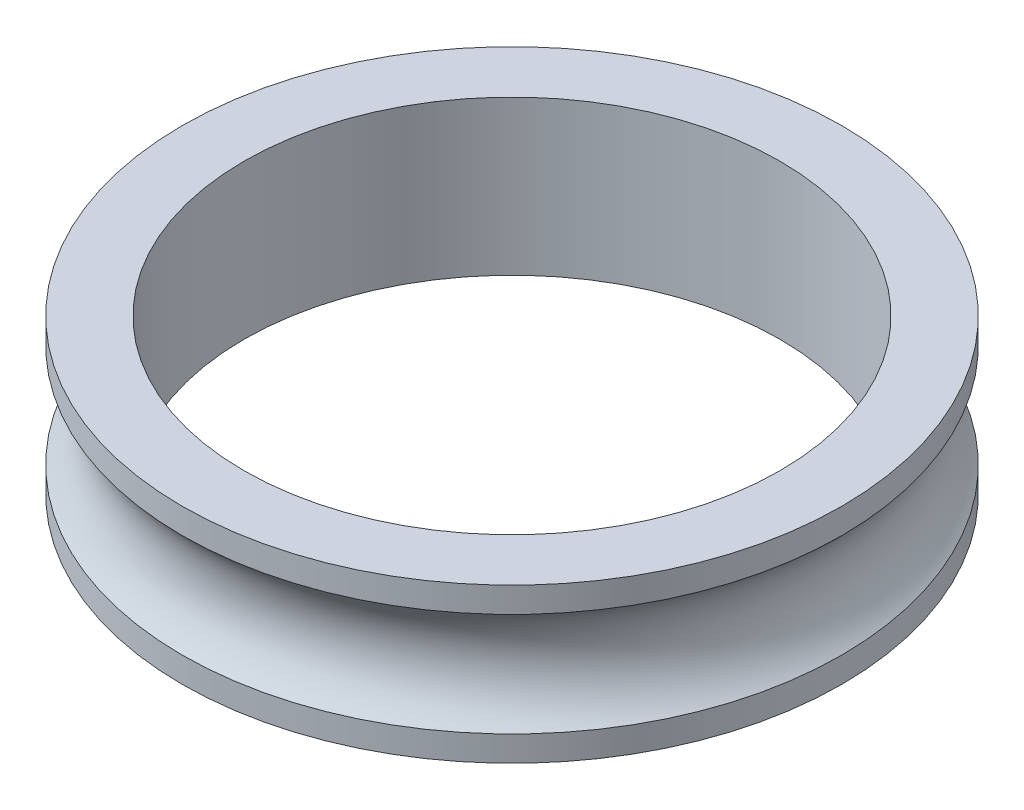
ISO-10303-21;
HEADER;
FILE_DESCRIPTION(('STEP AP214'),'2;1');
FILE_NAME('part.step','',(''),(''),'','','');
FILE_SCHEMA(('AUTOMOTIVE_DESIGN { 1 0 10303 214 1 1 1 1 }'));
ENDSEC;
DATA;
#1=APPLICATION_CONTEXT('core data for automotive mechanical design processes');
#2=APPLICATION_PROTOCOL_DEFINITION('international standard','automotive_design',2000,#1);
#3=PRODUCT_CONTEXT('',#1,'mechanical');
#4=PRODUCT('Part','Part','',(#3));
#5=PRODUCT_RELATED_PRODUCT_CATEGORY('part','',(#4));
#6=PRODUCT_DEFINITION_FORMATION('','',#4);
#7=PRODUCT_DEFINITION_CONTEXT('part definition',#1,'design');
#8=PRODUCT_DEFINITION('design','',#6,#7);
#9=PRODUCT_DEFINITION_SHAPE('','',#8);
#10=(LENGTH_UNIT() NAMED_UNIT(*) SI_UNIT(.MILLI.,.METRE.));
#11=(NAMED_UNIT(*) PLANE_ANGLE_UNIT() SI_UNIT($,.RADIAN.));
#12=(NAMED_UNIT(*) SI_UNIT($,.STERADIAN.) SOLID_ANGLE_UNIT());
#13=UNCERTAINTY_MEASURE_WITH_UNIT(LENGTH_MEASURE(1.E-05),#10,'distance_accuracy_value','');
#14=(GEOMETRIC_REPRESENTATION_CONTEXT(3) GLOBAL_UNCERTAINTY_ASSIGNED_CONTEXT((#13)) GLOBAL_UNIT_ASSIGNED_CONTEXT((#10,
#11,#12)) REPRESENTATION_CONTEXT('',''));
#15=CARTESIAN_POINT('',(0.,0.,0.));
#16=DIRECTION('',(0.,0.,1.));
#17=DIRECTION('',(1.,0.,0.));
#18=AXIS2_PLACEMENT_3D('',#15,#16,#17);
#19=CARTESIAN_POINT('',(34.75,10.,0.));
#20=DIRECTION('',(0.,-1.,0.));
#21=DIRECTION('',(0.,0.,-1.));
#22=AXIS2_PLACEMENT_3D('',#19,#20,#21);
#23=PLANE('',#22);
#24=CARTESIAN_POINT('',(0.,10.,0.));
#25=DIRECTION('',(0.,1.,0.));
#26=DIRECTION('',(0.,0.,1.));
#27=AXIS2_PLACEMENT_3D('',#24,#25,#26);
#28=CIRCLE('',#27,34.75);
#29=CARTESIAN_POINT('',(0.,10.,34.75));
#30=VERTEX_POINT('',#29);
#31=EDGE_CURVE('E10',#30,#30,#28,.T.);
#32=ORIENTED_EDGE('',*,*,#31,.F.);
#33=EDGE_LOOP('',(#32));
#34=FACE_BOUND('',#33,.T.);
#35=CARTESIAN_POINT('',(0.,10.,0.));
#36=DIRECTION('',(0.,1.,0.));
#37=DIRECTION('',(0.,0.,1.));
#38=AXIS2_PLACEMENT_3D('',#35,#36,#37);
#39=CIRCLE('',#38,42.75);
#40=CARTESIAN_POINT('',(0.,10.,42.75));
#41=VERTEX_POINT('',#40);
#42=EDGE_CURVE('E55',#41,#41,#39,.T.);
#43=ORIENTED_EDGE('',*,*,#42,.T.);
#44=EDGE_LOOP('',(#43));
#45=FACE_BOUND('',#44,.T.);
#46=ADVANCED_FACE('F33',(#34,#45),#23,.F.);
#47=CARTESIAN_POINT('',(0.,53.3742130251369,0.));
#48=DIRECTION('',(0.,1.,0.));
#49=DIRECTION('',(0.,0.,1.));
#50=AXIS2_PLACEMENT_3D('',#47,#48,#49);
#51=CYLINDRICAL_SURFACE('',#50,34.75);
#52=CARTESIAN_POINT('',(0.,-9.99999999999999,0.));
#53=DIRECTION('',(0.,1.,0.));
#54=DIRECTION('',(0.,0.,1.));
#55=AXIS2_PLACEMENT_3D('',#52,#53,#54);
#56=CIRCLE('',#55,34.75);
#57=CARTESIAN_POINT('',(0.,-9.99999999999999,34.75));
#58=VERTEX_POINT('',#57);
#59=EDGE_CURVE('E39',#58,#58,#56,.T.);
#60=ORIENTED_EDGE('',*,*,#59,.F.);
#61=EDGE_LOOP('',(#60));
#62=FACE_BOUND('',#61,.T.);
#63=ORIENTED_EDGE('',*,*,#31,.T.);
#64=EDGE_LOOP('',(#63));
#65=FACE_BOUND('',#64,.T.);
#66=ADVANCED_FACE('F80',(#62,#65),#51,.F.);
#67=CARTESIAN_POINT('',(34.75,-10.,0.));
#68=DIRECTION('',(0.,1.,0.));
#69=DIRECTION('',(0.,0.,1.));
#70=AXIS2_PLACEMENT_3D('',#67,#68,#69);
#71=PLANE('',#70);
#72=CARTESIAN_POINT('',(0.,-9.99999999999999,0.));
#73=DIRECTION('',(0.,1.,0.));
#74=DIRECTION('',(0.,0.,1.));
#75=AXIS2_PLACEMENT_3D('',#72,#73,#74);
#76=CIRCLE('',#75,42.75);
#77=CARTESIAN_POINT('',(0.,-9.99999999999999,42.75));
#78=VERTEX_POINT('',#77);
#79=EDGE_CURVE('E43',#78,#78,#76,.T.);
#80=ORIENTED_EDGE('',*,*,#79,.F.);
#81=EDGE_LOOP('',(#80));
#82=FACE_BOUND('',#81,.T.);
#83=ORIENTED_EDGE('',*,*,#59,.T.);
#84=EDGE_LOOP('',(#83));
#85=FACE_BOUND('',#84,.T.);
#86=ADVANCED_FACE('F75',(#82,#85),#71,.F.);
#87=CARTESIAN_POINT('',(0.,53.3742130251369,0.));
#88=DIRECTION('',(0.,1.,0.));
#89=DIRECTION('',(0.,0.,1.));
#90=AXIS2_PLACEMENT_3D('',#87,#88,#89);
#91=CYLINDRICAL_SURFACE('',#90,42.75);
#92=CARTESIAN_POINT('',(0.,-6.70820393249936,0.));
#93=DIRECTION('',(0.,1.,0.));
#94=DIRECTION('',(0.,0.,1.));
#95=AXIS2_PLACEMENT_3D('',#92,#93,#94);
#96=CIRCLE('',#95,42.75);
#97=CARTESIAN_POINT('',(0.,-6.70820393249936,42.75));
#98=VERTEX_POINT('',#97);
#99=EDGE_CURVE('E47',#98,#98,#96,.T.);
#100=ORIENTED_EDGE('',*,*,#99,.F.);
#101=EDGE_LOOP('',(#100));
#102=FACE_BOUND('',#101,.T.);
#103=ORIENTED_EDGE('',*,*,#79,.T.);
#104=EDGE_LOOP('',(#103));
#105=FACE_BOUND('',#104,.T.);
#106=ADVANCED_FACE('F69',(#102,#105),#91,.T.);
#107=CARTESIAN_POINT('',(0.,0.,0.));
#108=DIRECTION('',(0.,1.,0.));
#109=DIRECTION('',(0.,0.,1.));
#110=AXIS2_PLACEMENT_3D('',#107,#108,#109);
#111=TOROIDAL_SURFACE('',#110,48.75,9.);
#112=CARTESIAN_POINT('',(0.,6.70820393249936,0.));
#113=DIRECTION('',(0.,1.,0.));
#114=DIRECTION('',(0.,0.,1.));
#115=AXIS2_PLACEMENT_3D('',#112,#113,#114);
#116=CIRCLE('',#115,42.75);
#117=CARTESIAN_POINT('',(0.,6.70820393249936,42.75));
#118=VERTEX_POINT('',#117);
#119=EDGE_CURVE('E52',#118,#118,#116,.T.);
#120=ORIENTED_EDGE('',*,*,#119,.F.);
#121=EDGE_LOOP('',(#120));
#122=FACE_BOUND('',#121,.T.);
#123=ORIENTED_EDGE('',*,*,#99,.T.);
#124=EDGE_LOOP('',(#123));
#125=FACE_BOUND('',#124,.T.);
#126=ADVANCED_FACE('F63',(#122,#125),#111,.F.);
#127=CARTESIAN_POINT('',(0.,53.3742130251369,0.));
#128=DIRECTION('',(0.,1.,0.));
#129=DIRECTION('',(0.,0.,1.));
#130=AXIS2_PLACEMENT_3D('',#127,#128,#129);
#131=CYLINDRICAL_SURFACE('',#130,42.75);
#132=ORIENTED_EDGE('',*,*,#42,.F.);
#133=EDGE_LOOP('',(#132));
#134=FACE_BOUND('',#133,.T.);
#135=ORIENTED_EDGE('',*,*,#119,.T.);
#136=EDGE_LOOP('',(#135));
#137=FACE_BOUND('',#136,.T.);
#138=ADVANCED_FACE('F60',(#134,#137),#131,.T.);
#139=CLOSED_SHELL('',(#46,#66,#86,#106,#126,#138));
#140=MANIFOLD_SOLID_BREP('B2',#139);
#141=ADVANCED_BREP_SHAPE_REPRESENTATION('',(#18,#140),#14);
#142=SHAPE_DEFINITION_REPRESENTATION(#9,#141);
ENDSEC;
END-ISO-10303-21;
